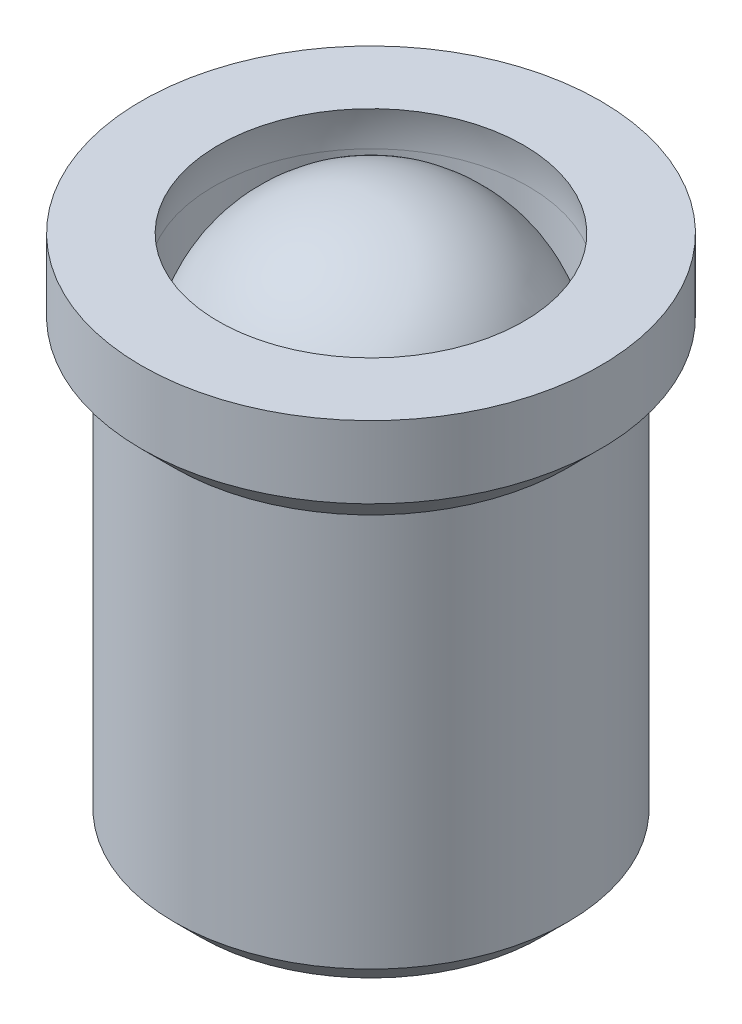
ISO-10303-21;
HEADER;
FILE_DESCRIPTION(('STEP AP214'),'2;1');
FILE_NAME('part.step','',(''),(''),'','','');
FILE_SCHEMA(('AUTOMOTIVE_DESIGN { 1 0 10303 214 1 1 1 1 }'));
ENDSEC;
DATA;
#1=APPLICATION_CONTEXT('core data for automotive mechanical design processes');
#2=APPLICATION_PROTOCOL_DEFINITION('international standard','automotive_design',2000,#1);
#3=PRODUCT_CONTEXT('',#1,'mechanical');
#4=PRODUCT('Part','Part','',(#3));
#5=PRODUCT_RELATED_PRODUCT_CATEGORY('part','',(#4));
#6=PRODUCT_DEFINITION_FORMATION('','',#4);
#7=PRODUCT_DEFINITION_CONTEXT('part definition',#1,'design');
#8=PRODUCT_DEFINITION('design','',#6,#7);
#9=PRODUCT_DEFINITION_SHAPE('','',#8);
#10=(LENGTH_UNIT() NAMED_UNIT(*) SI_UNIT(.MILLI.,.METRE.));
#11=(NAMED_UNIT(*) PLANE_ANGLE_UNIT() SI_UNIT($,.RADIAN.));
#12=(NAMED_UNIT(*) SI_UNIT($,.STERADIAN.) SOLID_ANGLE_UNIT());
#13=UNCERTAINTY_MEASURE_WITH_UNIT(LENGTH_MEASURE(1.E-05),#10,'distance_accuracy_value','');
#14=(GEOMETRIC_REPRESENTATION_CONTEXT(3) GLOBAL_UNCERTAINTY_ASSIGNED_CONTEXT((#13)) GLOBAL_UNIT_ASSIGNED_CONTEXT((#10,
#11,#12)) REPRESENTATION_CONTEXT('',''));
#15=CARTESIAN_POINT('',(0.,0.,0.));
#16=DIRECTION('',(0.,0.,1.));
#17=DIRECTION('',(1.,0.,0.));
#18=AXIS2_PLACEMENT_3D('',#15,#16,#17);
#19=CARTESIAN_POINT('',(0.,3.06,0.));
#20=DIRECTION('',(0.,1.,0.));
#21=DIRECTION('',(0.,0.,-1.));
#22=AXIS2_PLACEMENT_3D('',#19,#20,#21);
#23=SPHERICAL_SURFACE('',#22,1.19);
#24=CARTESIAN_POINT('',(0.,4.25,0.));
#25=VERTEX_POINT('',#24);
#26=VERTEX_LOOP('',#25);
#27=FACE_BOUND('',#26,.T.);
#28=ADVANCED_FACE('F38',(#27),#23,.T.);
#29=CLOSED_SHELL('',(#28));
#30=MANIFOLD_SOLID_BREP('B2',#29);
#31=CARTESIAN_POINT('',(0.,0.,0.));
#32=DIRECTION('',(0.,-1.,0.));
#33=DIRECTION('',(0.,0.,-1.));
#34=AXIS2_PLACEMENT_3D('',#31,#32,#33);
#35=CYLINDRICAL_SURFACE('',#34,1.5);
#36=CARTESIAN_POINT('',(0.,0.2,0.));
#37=DIRECTION('',(0.,-1.,0.));
#38=DIRECTION('',(0.,0.,-1.));
#39=AXIS2_PLACEMENT_3D('',#36,#37,#38);
#40=CIRCLE('',#39,1.5);
#41=CARTESIAN_POINT('',(0.,0.2,1.5));
#42=VERTEX_POINT('',#41);
#43=EDGE_CURVE('E58',#42,#42,#40,.F.);
#44=ORIENTED_EDGE('',*,*,#43,.T.);
#45=EDGE_LOOP('',(#44));
#46=FACE_BOUND('',#45,.T.);
#47=CARTESIAN_POINT('',(0.,3.2,0.));
#48=DIRECTION('',(0.,-1.,0.));
#49=DIRECTION('',(0.,0.,-1.));
#50=AXIS2_PLACEMENT_3D('',#47,#48,#49);
#51=CIRCLE('',#50,1.5);
#52=CARTESIAN_POINT('',(0.,3.2,-1.5));
#53=VERTEX_POINT('',#52);
#54=EDGE_CURVE('E66',#53,#53,#51,.T.);
#55=ORIENTED_EDGE('',*,*,#54,.T.);
#56=EDGE_LOOP('',(#55));
#57=FACE_BOUND('',#56,.T.);
#58=ADVANCED_FACE('F51',(#46,#57),#35,.T.);
#59=CARTESIAN_POINT('',(0.,0.,0.));
#60=DIRECTION('',(0.,-1.,0.));
#61=DIRECTION('',(0.,0.,-1.));
#62=AXIS2_PLACEMENT_3D('',#59,#60,#61);
#63=CYLINDRICAL_SURFACE('',#62,1.75);
#64=CARTESIAN_POINT('',(0.,3.45,0.));
#65=DIRECTION('',(0.,-1.,0.));
#66=DIRECTION('',(0.,0.,-1.));
#67=AXIS2_PLACEMENT_3D('',#64,#65,#66);
#68=CIRCLE('',#67,1.75);
#69=CARTESIAN_POINT('',(0.,3.45,-1.75));
#70=VERTEX_POINT('',#69);
#71=EDGE_CURVE('E37',#70,#70,#68,.F.);
#72=ORIENTED_EDGE('',*,*,#71,.T.);
#73=EDGE_LOOP('',(#72));
#74=FACE_BOUND('',#73,.T.);
#75=CARTESIAN_POINT('',(0.,4.,0.));
#76=DIRECTION('',(0.,-1.,0.));
#77=DIRECTION('',(0.,0.,-1.));
#78=AXIS2_PLACEMENT_3D('',#75,#76,#77);
#79=CIRCLE('',#78,1.75);
#80=CARTESIAN_POINT('',(0.,4.,-1.75));
#81=VERTEX_POINT('',#80);
#82=EDGE_CURVE('E71',#81,#81,#79,.T.);
#83=ORIENTED_EDGE('',*,*,#82,.T.);
#84=EDGE_LOOP('',(#83));
#85=FACE_BOUND('',#84,.T.);
#86=ADVANCED_FACE('F106',(#74,#85),#63,.T.);
#87=CARTESIAN_POINT('',(0.,4.,-1.75));
#88=DIRECTION('',(0.,1.,0.));
#89=DIRECTION('',(0.,0.,1.));
#90=AXIS2_PLACEMENT_3D('',#87,#88,#89);
#91=PLANE('',#90);
#92=CARTESIAN_POINT('',(0.,4.,0.));
#93=DIRECTION('',(0.,-1.,0.));
#94=DIRECTION('',(0.,0.,-1.));
#95=AXIS2_PLACEMENT_3D('',#92,#93,#94);
#96=CIRCLE('',#95,1.16443119161245);
#97=CARTESIAN_POINT('',(0.,4.,-1.16443119161245));
#98=VERTEX_POINT('',#97);
#99=EDGE_CURVE('E74',#98,#98,#96,.T.);
#100=ORIENTED_EDGE('',*,*,#99,.T.);
#101=EDGE_LOOP('',(#100));
#102=FACE_BOUND('',#101,.T.);
#103=ORIENTED_EDGE('',*,*,#82,.F.);
#104=EDGE_LOOP('',(#103));
#105=FACE_BOUND('',#104,.T.);
#106=ADVANCED_FACE('F112',(#102,#105),#91,.T.);
#107=CARTESIAN_POINT('',(0.,3.71,0.));
#108=DIRECTION('',(0.,-1.,0.));
#109=DIRECTION('',(0.,0.,-1.));
#110=AXIS2_PLACEMENT_3D('',#107,#108,#109);
#111=SPHERICAL_SURFACE('',#110,1.2);
#112=CARTESIAN_POINT('',(0.,3.71,0.));
#113=DIRECTION('',(0.,-1.,0.));
#114=DIRECTION('',(0.,0.,-1.));
#115=AXIS2_PLACEMENT_3D('',#112,#113,#114);
#116=CIRCLE('',#115,1.2);
#117=CARTESIAN_POINT('',(0.,3.71,-1.2));
#118=VERTEX_POINT('',#117);
#119=EDGE_CURVE('E77',#118,#118,#116,.T.);
#120=ORIENTED_EDGE('',*,*,#119,.T.);
#121=EDGE_LOOP('',(#120));
#122=FACE_BOUND('',#121,.T.);
#123=ORIENTED_EDGE('',*,*,#99,.F.);
#124=EDGE_LOOP('',(#123));
#125=FACE_BOUND('',#124,.T.);
#126=ADVANCED_FACE('F118',(#122,#125),#111,.F.);
#127=CARTESIAN_POINT('',(0.,0.,0.));
#128=DIRECTION('',(0.,-1.,0.));
#129=DIRECTION('',(0.,0.,-1.));
#130=AXIS2_PLACEMENT_3D('',#127,#128,#129);
#131=CYLINDRICAL_SURFACE('',#130,1.2);
#132=CARTESIAN_POINT('',(0.,0.3,0.));
#133=DIRECTION('',(0.,-1.,0.));
#134=DIRECTION('',(0.,0.,-1.));
#135=AXIS2_PLACEMENT_3D('',#132,#133,#134);
#136=CIRCLE('',#135,1.2);
#137=CARTESIAN_POINT('',(0.,0.3,-1.2));
#138=VERTEX_POINT('',#137);
#139=EDGE_CURVE('E80',#138,#138,#136,.T.);
#140=ORIENTED_EDGE('',*,*,#139,.T.);
#141=EDGE_LOOP('',(#140));
#142=FACE_BOUND('',#141,.T.);
#143=ORIENTED_EDGE('',*,*,#119,.F.);
#144=EDGE_LOOP('',(#143));
#145=FACE_BOUND('',#144,.T.);
#146=ADVANCED_FACE('F122',(#142,#145),#131,.F.);
#147=CARTESIAN_POINT('',(0.,0.3,-1.2));
#148=DIRECTION('',(0.,1.,0.));
#149=DIRECTION('',(0.,0.,1.));
#150=AXIS2_PLACEMENT_3D('',#147,#148,#149);
#151=PLANE('',#150);
#152=CARTESIAN_POINT('',(0.,0.3,0.));
#153=DIRECTION('',(0.,-1.,0.));
#154=DIRECTION('',(0.,0.,-1.));
#155=AXIS2_PLACEMENT_3D('',#152,#153,#154);
#156=CIRCLE('',#155,0.3);
#157=CARTESIAN_POINT('',(0.,0.3,-0.3));
#158=VERTEX_POINT('',#157);
#159=EDGE_CURVE('E83',#158,#158,#156,.T.);
#160=ORIENTED_EDGE('',*,*,#159,.T.);
#161=EDGE_LOOP('',(#160));
#162=FACE_BOUND('',#161,.T.);
#163=ORIENTED_EDGE('',*,*,#139,.F.);
#164=EDGE_LOOP('',(#163));
#165=FACE_BOUND('',#164,.T.);
#166=ADVANCED_FACE('F103',(#162,#165),#151,.T.);
#167=CARTESIAN_POINT('',(0.,0.,0.));
#168=DIRECTION('',(0.,-1.,0.));
#169=DIRECTION('',(0.,0.,-1.));
#170=AXIS2_PLACEMENT_3D('',#167,#168,#169);
#171=CYLINDRICAL_SURFACE('',#170,0.3);
#172=CARTESIAN_POINT('',(0.,0.,0.));
#173=DIRECTION('',(0.,-1.,0.));
#174=DIRECTION('',(0.,0.,-1.));
#175=AXIS2_PLACEMENT_3D('',#172,#173,#174);
#176=CIRCLE('',#175,0.3);
#177=CARTESIAN_POINT('',(0.,0.,-0.3));
#178=VERTEX_POINT('',#177);
#179=EDGE_CURVE('E86',#178,#178,#176,.T.);
#180=ORIENTED_EDGE('',*,*,#179,.T.);
#181=EDGE_LOOP('',(#180));
#182=FACE_BOUND('',#181,.T.);
#183=ORIENTED_EDGE('',*,*,#159,.F.);
#184=EDGE_LOOP('',(#183));
#185=FACE_BOUND('',#184,.T.);
#186=ADVANCED_FACE('F90',(#182,#185),#171,.F.);
#187=CARTESIAN_POINT('',(0.,0.,-0.3));
#188=DIRECTION('',(0.,-1.,0.));
#189=DIRECTION('',(0.,0.,-1.));
#190=AXIS2_PLACEMENT_3D('',#187,#188,#189);
#191=PLANE('',#190);
#192=CARTESIAN_POINT('',(0.,0.,0.));
#193=DIRECTION('',(0.,-1.,0.));
#194=DIRECTION('',(0.,0.,-1.));
#195=AXIS2_PLACEMENT_3D('',#192,#193,#194);
#196=CIRCLE('',#195,1.3);
#197=CARTESIAN_POINT('',(0.,0.,1.3));
#198=VERTEX_POINT('',#197);
#199=EDGE_CURVE('E62',#198,#198,#196,.T.);
#200=ORIENTED_EDGE('',*,*,#199,.T.);
#201=EDGE_LOOP('',(#200));
#202=FACE_BOUND('',#201,.T.);
#203=ORIENTED_EDGE('',*,*,#179,.F.);
#204=EDGE_LOOP('',(#203));
#205=FACE_BOUND('',#204,.T.);
#206=ADVANCED_FACE('F93',(#202,#205),#191,.T.);
#207=CARTESIAN_POINT('',(0.,0.,0.));
#208=DIRECTION('',(0.,1.,0.));
#209=DIRECTION('',(0.,0.,1.));
#210=AXIS2_PLACEMENT_3D('',#207,#208,#209);
#211=CONICAL_SURFACE('',#210,1.3,0.785398163397447);
#212=CARTESIAN_POINT('',(0.,0.2,1.5));
#213=CARTESIAN_POINT('',(0.,0.197916666666666,1.49791666666667));
#214=CARTESIAN_POINT('',(0.,0.195833333333333,1.49583333333333));
#215=CARTESIAN_POINT('',(0.,0.191666666666666,1.49166666666667));
#216=CARTESIAN_POINT('',(0.,0.189583333333333,1.48958333333333));
#217=CARTESIAN_POINT('',(0.,0.185416666666666,1.48541666666667));
#218=CARTESIAN_POINT('',(0.,0.183333333333333,1.48333333333333));
#219=CARTESIAN_POINT('',(0.,0.179166666666666,1.47916666666667));
#220=CARTESIAN_POINT('',(0.,0.177083333333333,1.47708333333333));
#221=CARTESIAN_POINT('',(0.,0.172916666666666,1.47291666666667));
#222=CARTESIAN_POINT('',(0.,0.170833333333333,1.47083333333333));
#223=CARTESIAN_POINT('',(0.,0.166666666666666,1.46666666666667));
#224=CARTESIAN_POINT('',(0.,0.164583333333333,1.46458333333333));
#225=CARTESIAN_POINT('',(0.,0.160416666666666,1.46041666666667));
#226=CARTESIAN_POINT('',(0.,0.158333333333333,1.45833333333333));
#227=CARTESIAN_POINT('',(0.,0.154166666666666,1.45416666666667));
#228=CARTESIAN_POINT('',(0.,0.152083333333333,1.45208333333333));
#229=CARTESIAN_POINT('',(0.,0.147916666666666,1.44791666666667));
#230=CARTESIAN_POINT('',(0.,0.145833333333333,1.44583333333333));
#231=CARTESIAN_POINT('',(0.,0.141666666666666,1.44166666666667));
#232=CARTESIAN_POINT('',(0.,0.139583333333333,1.43958333333333));
#233=CARTESIAN_POINT('',(0.,0.135416666666666,1.43541666666667));
#234=CARTESIAN_POINT('',(0.,0.133333333333333,1.43333333333333));
#235=CARTESIAN_POINT('',(0.,0.129166666666666,1.42916666666667));
#236=CARTESIAN_POINT('',(0.,0.127083333333333,1.42708333333333));
#237=CARTESIAN_POINT('',(0.,0.122916666666666,1.42291666666667));
#238=CARTESIAN_POINT('',(0.,0.120833333333333,1.42083333333333));
#239=CARTESIAN_POINT('',(0.,0.116666666666666,1.41666666666667));
#240=CARTESIAN_POINT('',(0.,0.114583333333333,1.41458333333333));
#241=CARTESIAN_POINT('',(0.,0.110416666666666,1.41041666666667));
#242=CARTESIAN_POINT('',(0.,0.108333333333333,1.40833333333333));
#243=CARTESIAN_POINT('',(0.,0.104166666666666,1.40416666666667));
#244=CARTESIAN_POINT('',(0.,0.102083333333333,1.40208333333333));
#245=CARTESIAN_POINT('',(0.,0.0979166666666665,1.39791666666667));
#246=CARTESIAN_POINT('',(0.,0.0958333333333332,1.39583333333333));
#247=CARTESIAN_POINT('',(0.,0.0916666666666665,1.39166666666667));
#248=CARTESIAN_POINT('',(0.,0.0895833333333332,1.38958333333333));
#249=CARTESIAN_POINT('',(0.,0.0854166666666665,1.38541666666667));
#250=CARTESIAN_POINT('',(0.,0.0833333333333332,1.38333333333333));
#251=CARTESIAN_POINT('',(0.,0.0791666666666665,1.37916666666667));
#252=CARTESIAN_POINT('',(0.,0.0770833333333332,1.37708333333333));
#253=CARTESIAN_POINT('',(0.,0.0729166666666665,1.37291666666667));
#254=CARTESIAN_POINT('',(0.,0.0708333333333332,1.37083333333333));
#255=CARTESIAN_POINT('',(0.,0.0666666666666666,1.36666666666667));
#256=CARTESIAN_POINT('',(0.,0.0645833333333332,1.36458333333333));
#257=CARTESIAN_POINT('',(0.,0.0604166666666666,1.36041666666667));
#258=CARTESIAN_POINT('',(0.,0.0583333333333332,1.35833333333333));
#259=CARTESIAN_POINT('',(0.,0.0541666666666666,1.35416666666667));
#260=CARTESIAN_POINT('',(0.,0.0520833333333333,1.35208333333333));
#261=CARTESIAN_POINT('',(0.,0.0479166666666666,1.34791666666667));
#262=CARTESIAN_POINT('',(0.,0.0458333333333333,1.34583333333333));
#263=CARTESIAN_POINT('',(0.,0.0416666666666666,1.34166666666667));
#264=CARTESIAN_POINT('',(0.,0.0395833333333333,1.33958333333333));
#265=CARTESIAN_POINT('',(0.,0.0354166666666666,1.33541666666667));
#266=CARTESIAN_POINT('',(0.,0.0333333333333333,1.33333333333333));
#267=CARTESIAN_POINT('',(0.,0.0291666666666666,1.32916666666667));
#268=CARTESIAN_POINT('',(0.,0.0270833333333333,1.32708333333333));
#269=CARTESIAN_POINT('',(0.,0.0229166666666666,1.32291666666667));
#270=CARTESIAN_POINT('',(0.,0.0208333333333333,1.32083333333333));
#271=CARTESIAN_POINT('',(0.,0.0166666666666666,1.31666666666667));
#272=CARTESIAN_POINT('',(0.,0.0145833333333333,1.31458333333333));
#273=CARTESIAN_POINT('',(0.,0.0104166666666666,1.31041666666667));
#274=CARTESIAN_POINT('',(0.,0.00833333333333332,1.30833333333333));
#275=CARTESIAN_POINT('',(0.,0.00416666666666666,1.30416666666667));
#276=CARTESIAN_POINT('',(0.,0.00208333333333333,1.30208333333333));
#277=CARTESIAN_POINT('',(0.,0.,1.3));
#278=B_SPLINE_CURVE_WITH_KNOTS('',3,(#212,#213,#214,#215,#216,#217,#218,#219,#220,#221,#222,
#223,#224,#225,#226,#227,#228,#229,#230,#231,#232,#233,#234,#235,#236,#237,#238,#239,#240,#241,
#242,#243,#244,#245,#246,#247,#248,#249,#250,#251,#252,#253,#254,#255,#256,#257,#258,#259,#260,
#261,#262,#263,#264,#265,#266,#267,#268,#269,#270,#271,#272,#273,#274,#275,#276,#277),
.UNSPECIFIED.,.F.,.F.,(4,2,2,2,2,2,2,2,2,2,2,2,2,2,2,2,2,2,2,2,2,2,2,2,2,2,2,2,2,2,2,2,4),(0.,
0.00883883476483181,0.0176776695296636,0.0265165042944954,0.0353553390593272,0.044194173824159,
0.0530330085889909,0.0618718433538227,0.0707106781186545,0.0795495128834865,0.0883883476483181,
0.0972271824131501,0.106066017177982,0.114904851942814,0.123743686707646,0.132582521472477,
0.141421356237309,0.150260191002141,0.159099025766973,0.167937860531805,0.176776695296636,
0.185615530061468,0.1944543648263,0.203293199591132,0.212132034355964,0.220970869120795,
0.229809703885627,0.238648538650459,0.247487373415291,0.256326208180123,0.265165042944955,
0.274003877709786,0.282842712474618),.UNSPECIFIED.);
#279=EDGE_CURVE('BSEAM95',#42,#198,#278,.T.);
#280=ORIENTED_EDGE('',*,*,#43,.F.);
#281=ORIENTED_EDGE('',*,*,#199,.F.);
#282=ORIENTED_EDGE('',*,*,#279,.T.);
#283=ORIENTED_EDGE('',*,*,#279,.F.);
#284=EDGE_LOOP('',(#280,#282,#281,#283));
#285=FACE_BOUND('',#284,.T.);
#286=ADVANCED_FACE('F95',(#285),#211,.T.);
#287=CARTESIAN_POINT('',(0.,3.2,0.));
#288=DIRECTION('',(0.,1.,0.));
#289=DIRECTION('',(0.,0.,1.));
#290=AXIS2_PLACEMENT_3D('',#287,#288,#289);
#291=CONICAL_SURFACE('',#290,1.5,0.785398163397447);
#292=ORIENTED_EDGE('',*,*,#71,.F.);
#293=EDGE_LOOP('',(#292));
#294=FACE_BOUND('',#293,.T.);
#295=ORIENTED_EDGE('',*,*,#54,.F.);
#296=EDGE_LOOP('',(#295));
#297=FACE_BOUND('',#296,.T.);
#298=ADVANCED_FACE('F53',(#294,#297),#291,.T.);
#299=CLOSED_SHELL('',(#58,#86,#106,#126,#146,#166,#186,#206,#286,#298));
#300=MANIFOLD_SOLID_BREP('B6',#299);
#301=ADVANCED_BREP_SHAPE_REPRESENTATION('',(#18,#30,#300),#14);
#302=SHAPE_DEFINITION_REPRESENTATION(#9,#301);
ENDSEC;
END-ISO-10303-21;
